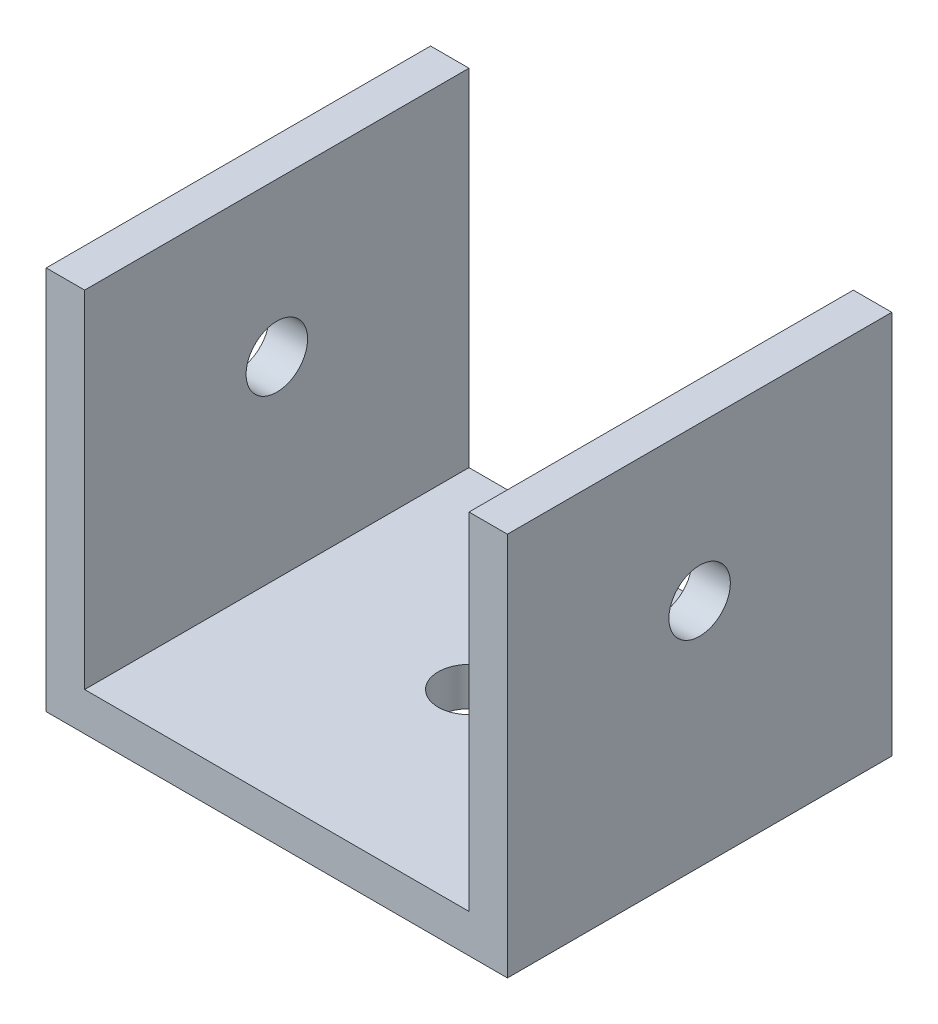
ISO-10303-21;
HEADER;
FILE_DESCRIPTION(('STEP AP214'),'2;1');
FILE_NAME('part.step','',(''),(''),'','','');
FILE_SCHEMA(('AUTOMOTIVE_DESIGN { 1 0 10303 214 1 1 1 1 }'));
ENDSEC;
DATA;
#1=APPLICATION_CONTEXT('core data for automotive mechanical design processes');
#2=APPLICATION_PROTOCOL_DEFINITION('international standard','automotive_design',2000,#1);
#3=PRODUCT_CONTEXT('',#1,'mechanical');
#4=PRODUCT('Part','Part','',(#3));
#5=PRODUCT_RELATED_PRODUCT_CATEGORY('part','',(#4));
#6=PRODUCT_DEFINITION_FORMATION('','',#4);
#7=PRODUCT_DEFINITION_CONTEXT('part definition',#1,'design');
#8=PRODUCT_DEFINITION('design','',#6,#7);
#9=PRODUCT_DEFINITION_SHAPE('','',#8);
#10=(LENGTH_UNIT() NAMED_UNIT(*) SI_UNIT(.MILLI.,.METRE.));
#11=(NAMED_UNIT(*) PLANE_ANGLE_UNIT() SI_UNIT($,.RADIAN.));
#12=(NAMED_UNIT(*) SI_UNIT($,.STERADIAN.) SOLID_ANGLE_UNIT());
#13=UNCERTAINTY_MEASURE_WITH_UNIT(LENGTH_MEASURE(1.E-05),#10,'distance_accuracy_value','');
#14=(GEOMETRIC_REPRESENTATION_CONTEXT(3) GLOBAL_UNCERTAINTY_ASSIGNED_CONTEXT((#13)) GLOBAL_UNIT_ASSIGNED_CONTEXT((#10,
#11,#12)) REPRESENTATION_CONTEXT('',''));
#15=CARTESIAN_POINT('',(0.,0.,0.));
#16=DIRECTION('',(0.,0.,1.));
#17=DIRECTION('',(1.,0.,0.));
#18=AXIS2_PLACEMENT_3D('',#15,#16,#17);
#19=CARTESIAN_POINT('',(-25.,5.,-25.));
#20=DIRECTION('',(0.,0.,1.));
#21=DIRECTION('',(1.,0.,0.));
#22=AXIS2_PLACEMENT_3D('',#19,#20,#21);
#23=PLANE('',#22);
#24=DIRECTION('',(-1.,0.,0.));
#25=VECTOR('',#24,1.);
#26=CARTESIAN_POINT('',(-25.,0.,-25.));
#27=LINE('',#26,#25);
#28=CARTESIAN_POINT('',(30.,0.,-25.));
#29=VERTEX_POINT('',#28);
#30=CARTESIAN_POINT('',(-30.,0.,-25.));
#31=VERTEX_POINT('',#30);
#32=EDGE_CURVE('E180',#29,#31,#27,.T.);
#33=ORIENTED_EDGE('',*,*,#32,.T.);
#34=DIRECTION('',(0.,1.,0.));
#35=VECTOR('',#34,1.);
#36=CARTESIAN_POINT('',(-30.,0.,-25.));
#37=LINE('',#36,#35);
#38=CARTESIAN_POINT('',(-30.,50.,-25.));
#39=VERTEX_POINT('',#38);
#40=EDGE_CURVE('E133',#31,#39,#37,.T.);
#41=ORIENTED_EDGE('',*,*,#40,.T.);
#42=DIRECTION('',(1.,0.,0.));
#43=VECTOR('',#42,1.);
#44=CARTESIAN_POINT('',(-30.,50.,-25.));
#45=LINE('',#44,#43);
#46=CARTESIAN_POINT('',(-25.,50.,-25.));
#47=VERTEX_POINT('',#46);
#48=EDGE_CURVE('E117',#39,#47,#45,.T.);
#49=ORIENTED_EDGE('',*,*,#48,.T.);
#50=DIRECTION('',(0.,1.,0.));
#51=VECTOR('',#50,1.);
#52=CARTESIAN_POINT('',(-25.,0.,-25.));
#53=LINE('',#52,#51);
#54=CARTESIAN_POINT('',(-25.,5.,-25.));
#55=VERTEX_POINT('',#54);
#56=EDGE_CURVE('E128',#55,#47,#53,.T.);
#57=ORIENTED_EDGE('',*,*,#56,.F.);
#58=DIRECTION('',(-1.,0.,0.));
#59=VECTOR('',#58,1.);
#60=CARTESIAN_POINT('',(-25.,5.,-25.));
#61=LINE('',#60,#59);
#62=CARTESIAN_POINT('',(25.,5.,-25.));
#63=VERTEX_POINT('',#62);
#64=EDGE_CURVE('E185',#63,#55,#61,.T.);
#65=ORIENTED_EDGE('',*,*,#64,.F.);
#66=DIRECTION('',(0.,1.,0.));
#67=VECTOR('',#66,1.);
#68=CARTESIAN_POINT('',(25.,0.,-25.));
#69=LINE('',#68,#67);
#70=CARTESIAN_POINT('',(25.,50.,-25.));
#71=VERTEX_POINT('',#70);
#72=EDGE_CURVE('E64',#63,#71,#69,.T.);
#73=ORIENTED_EDGE('',*,*,#72,.T.);
#74=DIRECTION('',(-1.,0.,0.));
#75=VECTOR('',#74,1.);
#76=CARTESIAN_POINT('',(30.,50.,-25.));
#77=LINE('',#76,#75);
#78=CARTESIAN_POINT('',(30.,50.,-25.));
#79=VERTEX_POINT('',#78);
#80=EDGE_CURVE('E176',#79,#71,#77,.T.);
#81=ORIENTED_EDGE('',*,*,#80,.F.);
#82=DIRECTION('',(0.,1.,0.));
#83=VECTOR('',#82,1.);
#84=CARTESIAN_POINT('',(30.,0.,-25.));
#85=LINE('',#84,#83);
#86=EDGE_CURVE('E159',#29,#79,#85,.T.);
#87=ORIENTED_EDGE('',*,*,#86,.F.);
#88=EDGE_LOOP('',(#33,#41,#49,#57,#65,#73,#81,#87));
#89=FACE_BOUND('',#88,.T.);
#90=ADVANCED_FACE('F39',(#89),#23,.F.);
#91=CARTESIAN_POINT('',(-25.,5.,25.));
#92=DIRECTION('',(0.,0.,-1.));
#93=DIRECTION('',(-1.,0.,0.));
#94=AXIS2_PLACEMENT_3D('',#91,#92,#93);
#95=PLANE('',#94);
#96=DIRECTION('',(1.,0.,0.));
#97=VECTOR('',#96,1.);
#98=CARTESIAN_POINT('',(-25.,0.,25.));
#99=LINE('',#98,#97);
#100=CARTESIAN_POINT('',(-30.,0.,25.));
#101=VERTEX_POINT('',#100);
#102=CARTESIAN_POINT('',(30.,0.,25.));
#103=VERTEX_POINT('',#102);
#104=EDGE_CURVE('E186',#101,#103,#99,.T.);
#105=ORIENTED_EDGE('',*,*,#104,.T.);
#106=DIRECTION('',(0.,-1.,0.));
#107=VECTOR('',#106,1.);
#108=CARTESIAN_POINT('',(30.,0.,25.));
#109=LINE('',#108,#107);
#110=CARTESIAN_POINT('',(30.,50.,25.));
#111=VERTEX_POINT('',#110);
#112=EDGE_CURVE('E150',#111,#103,#109,.T.);
#113=ORIENTED_EDGE('',*,*,#112,.F.);
#114=DIRECTION('',(-1.,0.,0.));
#115=VECTOR('',#114,1.);
#116=CARTESIAN_POINT('',(30.,50.,25.));
#117=LINE('',#116,#115);
#118=CARTESIAN_POINT('',(25.,50.,25.));
#119=VERTEX_POINT('',#118);
#120=EDGE_CURVE('E165',#111,#119,#117,.T.);
#121=ORIENTED_EDGE('',*,*,#120,.T.);
#122=DIRECTION('',(0.,-1.,0.));
#123=VECTOR('',#122,1.);
#124=CARTESIAN_POINT('',(25.,0.,25.));
#125=LINE('',#124,#123);
#126=CARTESIAN_POINT('',(25.,5.,25.));
#127=VERTEX_POINT('',#126);
#128=EDGE_CURVE('E116',#119,#127,#125,.T.);
#129=ORIENTED_EDGE('',*,*,#128,.T.);
#130=DIRECTION('',(1.,0.,0.));
#131=VECTOR('',#130,1.);
#132=CARTESIAN_POINT('',(-25.,5.,25.));
#133=LINE('',#132,#131);
#134=CARTESIAN_POINT('',(-25.,5.,25.));
#135=VERTEX_POINT('',#134);
#136=EDGE_CURVE('E11',#135,#127,#133,.T.);
#137=ORIENTED_EDGE('',*,*,#136,.F.);
#138=DIRECTION('',(0.,-1.,0.));
#139=VECTOR('',#138,1.);
#140=CARTESIAN_POINT('',(-25.,0.,25.));
#141=LINE('',#140,#139);
#142=CARTESIAN_POINT('',(-25.,50.,25.));
#143=VERTEX_POINT('',#142);
#144=EDGE_CURVE('E56',#143,#135,#141,.T.);
#145=ORIENTED_EDGE('',*,*,#144,.F.);
#146=DIRECTION('',(1.,0.,0.));
#147=VECTOR('',#146,1.);
#148=CARTESIAN_POINT('',(-30.,50.,25.));
#149=LINE('',#148,#147);
#150=CARTESIAN_POINT('',(-30.,50.,25.));
#151=VERTEX_POINT('',#150);
#152=EDGE_CURVE('E106',#151,#143,#149,.T.);
#153=ORIENTED_EDGE('',*,*,#152,.F.);
#154=DIRECTION('',(0.,-1.,0.));
#155=VECTOR('',#154,1.);
#156=CARTESIAN_POINT('',(-30.,0.,25.));
#157=LINE('',#156,#155);
#158=EDGE_CURVE('E109',#151,#101,#157,.T.);
#159=ORIENTED_EDGE('',*,*,#158,.T.);
#160=EDGE_LOOP('',(#105,#113,#121,#129,#137,#145,#153,#159));
#161=FACE_BOUND('',#160,.T.);
#162=ADVANCED_FACE('F108',(#161),#95,.F.);
#163=CARTESIAN_POINT('',(0.,5.,0.));
#164=DIRECTION('',(0.,1.,0.));
#165=DIRECTION('',(0.,0.,1.));
#166=AXIS2_PLACEMENT_3D('',#163,#164,#165);
#167=PLANE('',#166);
#168=CARTESIAN_POINT('',(0.,5.,0.));
#169=DIRECTION('',(0.,1.,0.));
#170=DIRECTION('',(0.,0.,1.));
#171=AXIS2_PLACEMENT_3D('',#168,#169,#170);
#172=CIRCLE('',#171,4.);
#173=CARTESIAN_POINT('',(0.,5.,4.));
#174=VERTEX_POINT('',#173);
#175=EDGE_CURVE('E273',#174,#174,#172,.T.);
#176=ORIENTED_EDGE('',*,*,#175,.F.);
#177=EDGE_LOOP('',(#176));
#178=FACE_BOUND('',#177,.T.);
#179=DIRECTION('',(0.,0.,-1.));
#180=VECTOR('',#179,1.);
#181=CARTESIAN_POINT('',(25.,5.,-25.));
#182=LINE('',#181,#180);
#183=EDGE_CURVE('E181',#127,#63,#182,.T.);
#184=ORIENTED_EDGE('',*,*,#183,.T.);
#185=ORIENTED_EDGE('',*,*,#64,.T.);
#186=DIRECTION('',(0.,0.,1.));
#187=VECTOR('',#186,1.);
#188=CARTESIAN_POINT('',(-25.,5.,-25.));
#189=LINE('',#188,#187);
#190=EDGE_CURVE('E48',#55,#135,#189,.T.);
#191=ORIENTED_EDGE('',*,*,#190,.T.);
#192=ORIENTED_EDGE('',*,*,#136,.T.);
#193=EDGE_LOOP('',(#184,#185,#191,#192));
#194=FACE_BOUND('',#193,.T.);
#195=ADVANCED_FACE('F209',(#178,#194),#167,.T.);
#196=CARTESIAN_POINT('',(0.,0.,0.));
#197=DIRECTION('',(0.,1.,0.));
#198=DIRECTION('',(0.,0.,1.));
#199=AXIS2_PLACEMENT_3D('',#196,#197,#198);
#200=PLANE('',#199);
#201=CARTESIAN_POINT('',(0.,0.,0.));
#202=DIRECTION('',(0.,1.,0.));
#203=DIRECTION('',(0.,0.,1.));
#204=AXIS2_PLACEMENT_3D('',#201,#202,#203);
#205=CIRCLE('',#204,4.);
#206=CARTESIAN_POINT('',(0.,0.,4.));
#207=VERTEX_POINT('',#206);
#208=EDGE_CURVE('E42',#207,#207,#205,.T.);
#209=ORIENTED_EDGE('',*,*,#208,.T.);
#210=EDGE_LOOP('',(#209));
#211=FACE_BOUND('',#210,.T.);
#212=ORIENTED_EDGE('',*,*,#32,.F.);
#213=DIRECTION('',(0.,0.,-1.));
#214=VECTOR('',#213,1.);
#215=CARTESIAN_POINT('',(30.,0.,25.));
#216=LINE('',#215,#214);
#217=EDGE_CURVE('E154',#103,#29,#216,.T.);
#218=ORIENTED_EDGE('',*,*,#217,.F.);
#219=ORIENTED_EDGE('',*,*,#104,.F.);
#220=DIRECTION('',(0.,0.,-1.));
#221=VECTOR('',#220,1.);
#222=CARTESIAN_POINT('',(-30.,0.,25.));
#223=LINE('',#222,#221);
#224=EDGE_CURVE('E126',#101,#31,#223,.T.);
#225=ORIENTED_EDGE('',*,*,#224,.T.);
#226=EDGE_LOOP('',(#212,#218,#219,#225));
#227=FACE_BOUND('',#226,.T.);
#228=ADVANCED_FACE('F197',(#211,#227),#200,.F.);
#229=CARTESIAN_POINT('',(25.,0.,0.));
#230=DIRECTION('',(-1.,0.,0.));
#231=DIRECTION('',(0.,0.,1.));
#232=AXIS2_PLACEMENT_3D('',#229,#230,#231);
#233=PLANE('',#232);
#234=CARTESIAN_POINT('',(25.,30.,0.));
#235=DIRECTION('',(-1.,0.,0.));
#236=DIRECTION('',(0.,0.,1.));
#237=AXIS2_PLACEMENT_3D('',#234,#235,#236);
#238=CIRCLE('',#237,4.);
#239=CARTESIAN_POINT('',(25.,30.,-4.));
#240=VERTEX_POINT('',#239);
#241=EDGE_CURVE('E266',#240,#240,#238,.T.);
#242=ORIENTED_EDGE('',*,*,#241,.F.);
#243=EDGE_LOOP('',(#242));
#244=FACE_BOUND('',#243,.T.);
#245=ORIENTED_EDGE('',*,*,#183,.F.);
#246=ORIENTED_EDGE('',*,*,#128,.F.);
#247=DIRECTION('',(0.,0.,1.));
#248=VECTOR('',#247,1.);
#249=CARTESIAN_POINT('',(25.,50.,25.));
#250=LINE('',#249,#248);
#251=EDGE_CURVE('E155',#71,#119,#250,.T.);
#252=ORIENTED_EDGE('',*,*,#251,.F.);
#253=ORIENTED_EDGE('',*,*,#72,.F.);
#254=EDGE_LOOP('',(#245,#246,#252,#253));
#255=FACE_BOUND('',#254,.T.);
#256=ADVANCED_FACE('F207',(#244,#255),#233,.T.);
#257=CARTESIAN_POINT('',(30.,50.,25.));
#258=DIRECTION('',(0.,-1.,0.));
#259=DIRECTION('',(0.,0.,-1.));
#260=AXIS2_PLACEMENT_3D('',#257,#258,#259);
#261=PLANE('',#260);
#262=ORIENTED_EDGE('',*,*,#251,.T.);
#263=ORIENTED_EDGE('',*,*,#120,.F.);
#264=DIRECTION('',(0.,0.,1.));
#265=VECTOR('',#264,1.);
#266=CARTESIAN_POINT('',(30.,50.,25.));
#267=LINE('',#266,#265);
#268=EDGE_CURVE('E162',#79,#111,#267,.T.);
#269=ORIENTED_EDGE('',*,*,#268,.F.);
#270=ORIENTED_EDGE('',*,*,#80,.T.);
#271=EDGE_LOOP('',(#262,#263,#269,#270));
#272=FACE_BOUND('',#271,.T.);
#273=ADVANCED_FACE('F205',(#272),#261,.F.);
#274=CARTESIAN_POINT('',(30.,0.,0.));
#275=DIRECTION('',(-1.,0.,0.));
#276=DIRECTION('',(0.,0.,1.));
#277=AXIS2_PLACEMENT_3D('',#274,#275,#276);
#278=PLANE('',#277);
#279=CARTESIAN_POINT('',(30.,30.,0.));
#280=DIRECTION('',(1.,0.,0.));
#281=DIRECTION('',(0.,0.,-1.));
#282=AXIS2_PLACEMENT_3D('',#279,#280,#281);
#283=CIRCLE('',#282,4.);
#284=CARTESIAN_POINT('',(30.,30.,-4.));
#285=VERTEX_POINT('',#284);
#286=EDGE_CURVE('E262',#285,#285,#283,.T.);
#287=ORIENTED_EDGE('',*,*,#286,.F.);
#288=EDGE_LOOP('',(#287));
#289=FACE_BOUND('',#288,.T.);
#290=ORIENTED_EDGE('',*,*,#112,.T.);
#291=ORIENTED_EDGE('',*,*,#217,.T.);
#292=ORIENTED_EDGE('',*,*,#86,.T.);
#293=ORIENTED_EDGE('',*,*,#268,.T.);
#294=EDGE_LOOP('',(#290,#291,#292,#293));
#295=FACE_BOUND('',#294,.T.);
#296=ADVANCED_FACE('F200',(#289,#295),#278,.F.);
#297=CARTESIAN_POINT('',(-25.,0.,0.));
#298=DIRECTION('',(1.,0.,0.));
#299=DIRECTION('',(0.,0.,1.));
#300=AXIS2_PLACEMENT_3D('',#297,#298,#299);
#301=PLANE('',#300);
#302=CARTESIAN_POINT('',(-25.,30.,0.));
#303=DIRECTION('',(1.,0.,0.));
#304=DIRECTION('',(0.,0.,-1.));
#305=AXIS2_PLACEMENT_3D('',#302,#303,#304);
#306=CIRCLE('',#305,4.);
#307=CARTESIAN_POINT('',(-25.,30.,-4.));
#308=VERTEX_POINT('',#307);
#309=EDGE_CURVE('E257',#308,#308,#306,.T.);
#310=ORIENTED_EDGE('',*,*,#309,.F.);
#311=EDGE_LOOP('',(#310));
#312=FACE_BOUND('',#311,.T.);
#313=ORIENTED_EDGE('',*,*,#190,.F.);
#314=ORIENTED_EDGE('',*,*,#56,.T.);
#315=DIRECTION('',(0.,0.,1.));
#316=VECTOR('',#315,1.);
#317=CARTESIAN_POINT('',(-25.,50.,25.));
#318=LINE('',#317,#316);
#319=EDGE_CURVE('E143',#47,#143,#318,.T.);
#320=ORIENTED_EDGE('',*,*,#319,.T.);
#321=ORIENTED_EDGE('',*,*,#144,.T.);
#322=EDGE_LOOP('',(#313,#314,#320,#321));
#323=FACE_BOUND('',#322,.T.);
#324=ADVANCED_FACE('F211',(#312,#323),#301,.T.);
#325=CARTESIAN_POINT('',(-30.,50.,25.));
#326=DIRECTION('',(0.,1.,0.));
#327=DIRECTION('',(0.,0.,1.));
#328=AXIS2_PLACEMENT_3D('',#325,#326,#327);
#329=PLANE('',#328);
#330=ORIENTED_EDGE('',*,*,#319,.F.);
#331=ORIENTED_EDGE('',*,*,#48,.F.);
#332=DIRECTION('',(0.,0.,1.));
#333=VECTOR('',#332,1.);
#334=CARTESIAN_POINT('',(-30.,50.,25.));
#335=LINE('',#334,#333);
#336=EDGE_CURVE('E123',#39,#151,#335,.T.);
#337=ORIENTED_EDGE('',*,*,#336,.T.);
#338=ORIENTED_EDGE('',*,*,#152,.T.);
#339=EDGE_LOOP('',(#330,#331,#337,#338));
#340=FACE_BOUND('',#339,.T.);
#341=ADVANCED_FACE('F130',(#340),#329,.T.);
#342=CARTESIAN_POINT('',(-30.,0.,0.));
#343=DIRECTION('',(1.,0.,0.));
#344=DIRECTION('',(0.,0.,1.));
#345=AXIS2_PLACEMENT_3D('',#342,#343,#344);
#346=PLANE('',#345);
#347=CARTESIAN_POINT('',(-30.,30.,0.));
#348=DIRECTION('',(1.,0.,0.));
#349=DIRECTION('',(0.,0.,-1.));
#350=AXIS2_PLACEMENT_3D('',#347,#348,#349);
#351=CIRCLE('',#350,4.);
#352=CARTESIAN_POINT('',(-30.,30.,-4.));
#353=VERTEX_POINT('',#352);
#354=EDGE_CURVE('E260',#353,#353,#351,.T.);
#355=ORIENTED_EDGE('',*,*,#354,.T.);
#356=EDGE_LOOP('',(#355));
#357=FACE_BOUND('',#356,.T.);
#358=ORIENTED_EDGE('',*,*,#158,.F.);
#359=ORIENTED_EDGE('',*,*,#336,.F.);
#360=ORIENTED_EDGE('',*,*,#40,.F.);
#361=ORIENTED_EDGE('',*,*,#224,.F.);
#362=EDGE_LOOP('',(#358,#359,#360,#361));
#363=FACE_BOUND('',#362,.T.);
#364=ADVANCED_FACE('F121',(#357,#363),#346,.F.);
#365=CARTESIAN_POINT('',(0.,-5.,0.));
#366=DIRECTION('',(0.,1.,0.));
#367=DIRECTION('',(0.,0.,1.));
#368=AXIS2_PLACEMENT_3D('',#365,#366,#367);
#369=CYLINDRICAL_SURFACE('',#368,4.);
#370=ORIENTED_EDGE('',*,*,#175,.T.);
#371=EDGE_LOOP('',(#370));
#372=FACE_BOUND('',#371,.T.);
#373=ORIENTED_EDGE('',*,*,#208,.F.);
#374=EDGE_LOOP('',(#373));
#375=FACE_BOUND('',#374,.T.);
#376=ADVANCED_FACE('F241',(#372,#375),#369,.F.);
#377=CARTESIAN_POINT('',(-30.,30.,0.));
#378=DIRECTION('',(1.,0.,0.));
#379=DIRECTION('',(0.,0.,-1.));
#380=AXIS2_PLACEMENT_3D('',#377,#378,#379);
#381=CYLINDRICAL_SURFACE('',#380,4.);
#382=CARTESIAN_POINT('',(-25.,30.,-4.));
#383=CARTESIAN_POINT('',(-25.0520833333333,30.,-4.));
#384=CARTESIAN_POINT('',(-25.1041666666667,30.,-4.));
#385=CARTESIAN_POINT('',(-25.2083333333333,30.,-4.));
#386=CARTESIAN_POINT('',(-25.2604166666667,30.,-4.));
#387=CARTESIAN_POINT('',(-25.3645833333333,30.,-4.));
#388=CARTESIAN_POINT('',(-25.4166666666667,30.,-4.));
#389=CARTESIAN_POINT('',(-25.5208333333333,30.,-4.));
#390=CARTESIAN_POINT('',(-25.5729166666667,30.,-4.));
#391=CARTESIAN_POINT('',(-25.6770833333333,30.,-4.));
#392=CARTESIAN_POINT('',(-25.7291666666667,30.,-4.));
#393=CARTESIAN_POINT('',(-25.8333333333333,30.,-4.));
#394=CARTESIAN_POINT('',(-25.8854166666667,30.,-4.));
#395=CARTESIAN_POINT('',(-25.9895833333333,30.,-4.));
#396=CARTESIAN_POINT('',(-26.0416666666667,30.,-4.));
#397=CARTESIAN_POINT('',(-26.1458333333333,30.,-4.));
#398=CARTESIAN_POINT('',(-26.1979166666667,30.,-4.));
#399=CARTESIAN_POINT('',(-26.3020833333333,30.,-4.));
#400=CARTESIAN_POINT('',(-26.3541666666667,30.,-4.));
#401=CARTESIAN_POINT('',(-26.4583333333333,30.,-4.));
#402=CARTESIAN_POINT('',(-26.5104166666667,30.,-4.));
#403=CARTESIAN_POINT('',(-26.6145833333333,30.,-4.));
#404=CARTESIAN_POINT('',(-26.6666666666667,30.,-4.));
#405=CARTESIAN_POINT('',(-26.7708333333333,30.,-4.));
#406=CARTESIAN_POINT('',(-26.8229166666667,30.,-4.));
#407=CARTESIAN_POINT('',(-26.9270833333333,30.,-4.));
#408=CARTESIAN_POINT('',(-26.9791666666667,30.,-4.));
#409=CARTESIAN_POINT('',(-27.0833333333333,30.,-4.));
#410=CARTESIAN_POINT('',(-27.1354166666667,30.,-4.));
#411=CARTESIAN_POINT('',(-27.2395833333333,30.,-4.));
#412=CARTESIAN_POINT('',(-27.2916666666667,30.,-4.));
#413=CARTESIAN_POINT('',(-27.3958333333333,30.,-4.));
#414=CARTESIAN_POINT('',(-27.4479166666667,30.,-4.));
#415=CARTESIAN_POINT('',(-27.5520833333333,30.,-4.));
#416=CARTESIAN_POINT('',(-27.6041666666667,30.,-4.));
#417=CARTESIAN_POINT('',(-27.7083333333333,30.,-4.));
#418=CARTESIAN_POINT('',(-27.7604166666667,30.,-4.));
#419=CARTESIAN_POINT('',(-27.8645833333333,30.,-4.));
#420=CARTESIAN_POINT('',(-27.9166666666667,30.,-4.));
#421=CARTESIAN_POINT('',(-28.0208333333333,30.,-4.));
#422=CARTESIAN_POINT('',(-28.0729166666667,30.,-4.));
#423=CARTESIAN_POINT('',(-28.1770833333333,30.,-4.));
#424=CARTESIAN_POINT('',(-28.2291666666667,30.,-4.));
#425=CARTESIAN_POINT('',(-28.3333333333333,30.,-4.));
#426=CARTESIAN_POINT('',(-28.3854166666667,30.,-4.));
#427=CARTESIAN_POINT('',(-28.4895833333333,30.,-4.));
#428=CARTESIAN_POINT('',(-28.5416666666667,30.,-4.));
#429=CARTESIAN_POINT('',(-28.6458333333333,30.,-4.));
#430=CARTESIAN_POINT('',(-28.6979166666667,30.,-4.));
#431=CARTESIAN_POINT('',(-28.8020833333333,30.,-4.));
#432=CARTESIAN_POINT('',(-28.8541666666667,30.,-4.));
#433=CARTESIAN_POINT('',(-28.9583333333333,30.,-4.));
#434=CARTESIAN_POINT('',(-29.0104166666667,30.,-4.));
#435=CARTESIAN_POINT('',(-29.1145833333333,30.,-4.));
#436=CARTESIAN_POINT('',(-29.1666666666667,30.,-4.));
#437=CARTESIAN_POINT('',(-29.2708333333333,30.,-4.));
#438=CARTESIAN_POINT('',(-29.3229166666667,30.,-4.));
#439=CARTESIAN_POINT('',(-29.4270833333333,30.,-4.));
#440=CARTESIAN_POINT('',(-29.4791666666667,30.,-4.));
#441=CARTESIAN_POINT('',(-29.5833333333333,30.,-4.));
#442=CARTESIAN_POINT('',(-29.6354166666667,30.,-4.));
#443=CARTESIAN_POINT('',(-29.7395833333333,30.,-4.));
#444=CARTESIAN_POINT('',(-29.7916666666667,30.,-4.));
#445=CARTESIAN_POINT('',(-29.8958333333333,30.,-4.));
#446=CARTESIAN_POINT('',(-29.9479166666667,30.,-4.));
#447=CARTESIAN_POINT('',(-30.,30.,-4.));
#448=B_SPLINE_CURVE_WITH_KNOTS('',3,(#382,#383,#384,#385,#386,#387,#388,#389,#390,#391,#392,
#393,#394,#395,#396,#397,#398,#399,#400,#401,#402,#403,#404,#405,#406,#407,#408,#409,#410,#411,
#412,#413,#414,#415,#416,#417,#418,#419,#420,#421,#422,#423,#424,#425,#426,#427,#428,#429,#430,
#431,#432,#433,#434,#435,#436,#437,#438,#439,#440,#441,#442,#443,#444,#445,#446,#447),
.UNSPECIFIED.,.F.,.F.,(4,2,2,2,2,2,2,2,2,2,2,2,2,2,2,2,2,2,2,2,2,2,2,2,2,2,2,2,2,2,2,2,4),(0.,
0.15625,0.312500000000004,0.468750000000004,0.625000000000004,0.781250000000004,
0.937500000000004,1.09375,1.25,1.40625,1.5625,1.71875000000001,1.87500000000001,
2.03125000000001,2.18750000000001,2.34375000000001,2.50000000000001,2.65625000000001,
2.81250000000001,2.96875000000001,3.12500000000001,3.28125000000001,3.43750000000001,
3.59375000000001,3.75000000000001,3.90625000000002,4.06250000000002,4.21875000000002,
4.37500000000002,4.53125000000002,4.68750000000002,4.84375000000002,5.00000000000002),.UNSPECIFIED.);
#449=EDGE_CURVE('BSEAM245',#308,#353,#448,.T.);
#450=ORIENTED_EDGE('',*,*,#309,.T.);
#451=ORIENTED_EDGE('',*,*,#354,.F.);
#452=ORIENTED_EDGE('',*,*,#449,.T.);
#453=ORIENTED_EDGE('',*,*,#449,.F.);
#454=EDGE_LOOP('',(#450,#452,#451,#453));
#455=FACE_BOUND('',#454,.T.);
#456=ADVANCED_FACE('F245',(#455),#381,.F.);
#457=CARTESIAN_POINT('',(25.,30.,-4.));
#458=CARTESIAN_POINT('',(25.0520833333333,30.,-4.));
#459=CARTESIAN_POINT('',(25.1041666666667,30.,-4.));
#460=CARTESIAN_POINT('',(25.2083333333333,30.,-4.));
#461=CARTESIAN_POINT('',(25.2604166666667,30.,-4.));
#462=CARTESIAN_POINT('',(25.3645833333333,30.,-4.));
#463=CARTESIAN_POINT('',(25.4166666666667,30.,-4.));
#464=CARTESIAN_POINT('',(25.5208333333333,30.,-4.));
#465=CARTESIAN_POINT('',(25.5729166666667,30.,-4.));
#466=CARTESIAN_POINT('',(25.6770833333333,30.,-4.));
#467=CARTESIAN_POINT('',(25.7291666666667,30.,-4.));
#468=CARTESIAN_POINT('',(25.8333333333333,30.,-4.));
#469=CARTESIAN_POINT('',(25.8854166666667,30.,-4.));
#470=CARTESIAN_POINT('',(25.9895833333333,30.,-4.));
#471=CARTESIAN_POINT('',(26.0416666666667,30.,-4.));
#472=CARTESIAN_POINT('',(26.1458333333333,30.,-4.));
#473=CARTESIAN_POINT('',(26.1979166666667,30.,-4.));
#474=CARTESIAN_POINT('',(26.3020833333333,30.,-4.));
#475=CARTESIAN_POINT('',(26.3541666666667,30.,-4.));
#476=CARTESIAN_POINT('',(26.4583333333333,30.,-4.));
#477=CARTESIAN_POINT('',(26.5104166666667,30.,-4.));
#478=CARTESIAN_POINT('',(26.6145833333333,30.,-4.));
#479=CARTESIAN_POINT('',(26.6666666666667,30.,-4.));
#480=CARTESIAN_POINT('',(26.7708333333333,30.,-4.));
#481=CARTESIAN_POINT('',(26.8229166666667,30.,-4.));
#482=CARTESIAN_POINT('',(26.9270833333333,30.,-4.));
#483=CARTESIAN_POINT('',(26.9791666666667,30.,-4.));
#484=CARTESIAN_POINT('',(27.0833333333333,30.,-4.));
#485=CARTESIAN_POINT('',(27.1354166666667,30.,-4.));
#486=CARTESIAN_POINT('',(27.2395833333333,30.,-4.));
#487=CARTESIAN_POINT('',(27.2916666666667,30.,-4.));
#488=CARTESIAN_POINT('',(27.3958333333333,30.,-4.));
#489=CARTESIAN_POINT('',(27.4479166666667,30.,-4.));
#490=CARTESIAN_POINT('',(27.5520833333333,30.,-4.));
#491=CARTESIAN_POINT('',(27.6041666666667,30.,-4.));
#492=CARTESIAN_POINT('',(27.7083333333333,30.,-4.));
#493=CARTESIAN_POINT('',(27.7604166666667,30.,-4.));
#494=CARTESIAN_POINT('',(27.8645833333333,30.,-4.));
#495=CARTESIAN_POINT('',(27.9166666666667,30.,-4.));
#496=CARTESIAN_POINT('',(28.0208333333333,30.,-4.));
#497=CARTESIAN_POINT('',(28.0729166666667,30.,-4.));
#498=CARTESIAN_POINT('',(28.1770833333333,30.,-4.));
#499=CARTESIAN_POINT('',(28.2291666666667,30.,-4.));
#500=CARTESIAN_POINT('',(28.3333333333333,30.,-4.));
#501=CARTESIAN_POINT('',(28.3854166666667,30.,-4.));
#502=CARTESIAN_POINT('',(28.4895833333333,30.,-4.));
#503=CARTESIAN_POINT('',(28.5416666666667,30.,-4.));
#504=CARTESIAN_POINT('',(28.6458333333333,30.,-4.));
#505=CARTESIAN_POINT('',(28.6979166666667,30.,-4.));
#506=CARTESIAN_POINT('',(28.8020833333333,30.,-4.));
#507=CARTESIAN_POINT('',(28.8541666666667,30.,-4.));
#508=CARTESIAN_POINT('',(28.9583333333333,30.,-4.));
#509=CARTESIAN_POINT('',(29.0104166666667,30.,-4.));
#510=CARTESIAN_POINT('',(29.1145833333333,30.,-4.));
#511=CARTESIAN_POINT('',(29.1666666666667,30.,-4.));
#512=CARTESIAN_POINT('',(29.2708333333333,30.,-4.));
#513=CARTESIAN_POINT('',(29.3229166666667,30.,-4.));
#514=CARTESIAN_POINT('',(29.4270833333333,30.,-4.));
#515=CARTESIAN_POINT('',(29.4791666666667,30.,-4.));
#516=CARTESIAN_POINT('',(29.5833333333333,30.,-4.));
#517=CARTESIAN_POINT('',(29.6354166666667,30.,-4.));
#518=CARTESIAN_POINT('',(29.7395833333333,30.,-4.));
#519=CARTESIAN_POINT('',(29.7916666666667,30.,-4.));
#520=CARTESIAN_POINT('',(29.8958333333333,30.,-4.));
#521=CARTESIAN_POINT('',(29.9479166666667,30.,-4.));
#522=CARTESIAN_POINT('',(30.,30.,-4.));
#523=B_SPLINE_CURVE_WITH_KNOTS('',3,(#457,#458,#459,#460,#461,#462,#463,#464,#465,#466,#467,
#468,#469,#470,#471,#472,#473,#474,#475,#476,#477,#478,#479,#480,#481,#482,#483,#484,#485,#486,
#487,#488,#489,#490,#491,#492,#493,#494,#495,#496,#497,#498,#499,#500,#501,#502,#503,#504,#505,
#506,#507,#508,#509,#510,#511,#512,#513,#514,#515,#516,#517,#518,#519,#520,#521,#522),
.UNSPECIFIED.,.F.,.F.,(4,2,2,2,2,2,2,2,2,2,2,2,2,2,2,2,2,2,2,2,2,2,2,2,2,2,2,2,2,2,2,2,4),(0.,
0.156249999999997,0.3125,0.468750000000004,0.625000000000001,0.781249999999997,
0.937500000000001,1.09375,1.25,1.40625,1.5625,1.71875,1.875,2.03125,2.1875,2.34375000000001,2.5,
2.65625,2.8125,2.96875000000001,3.125,3.28125,3.4375,3.59375000000001,3.75,3.90625,4.0625,
4.21875000000001,4.375,4.53125,4.6875,4.84375000000001,5.),.UNSPECIFIED.);
#524=EDGE_CURVE('BSEAM248',#240,#285,#523,.T.);
#525=ORIENTED_EDGE('',*,*,#241,.T.);
#526=ORIENTED_EDGE('',*,*,#286,.T.);
#527=ORIENTED_EDGE('',*,*,#524,.T.);
#528=ORIENTED_EDGE('',*,*,#524,.F.);
#529=EDGE_LOOP('',(#525,#527,#526,#528));
#530=FACE_BOUND('',#529,.T.);
#531=ADVANCED_FACE('F248',(#530),#381,.F.);
#532=CLOSED_SHELL('',(#90,#162,#195,#228,#256,#273,#296,#324,#341,#364,#376,#456,#531));
#533=MANIFOLD_SOLID_BREP('B2',#532);
#534=ADVANCED_BREP_SHAPE_REPRESENTATION('',(#18,#533),#14);
#535=SHAPE_DEFINITION_REPRESENTATION(#9,#534);
ENDSEC;
END-ISO-10303-21;
